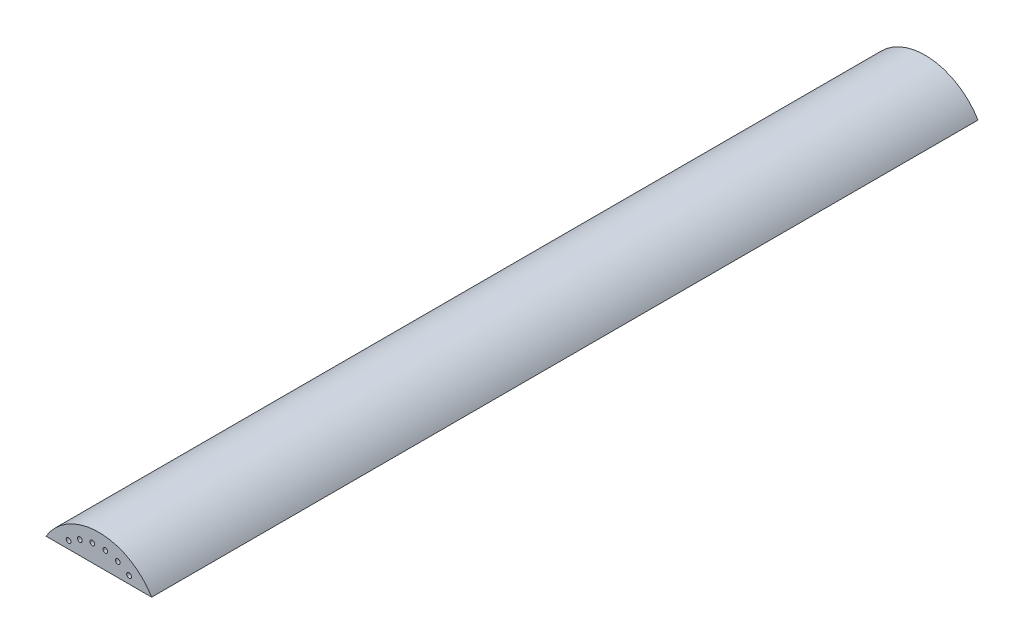
ISO-10303-21;
HEADER;
FILE_DESCRIPTION(('STEP AP214'),'2;1');
FILE_NAME('part.step','',(''),(''),'','','');
FILE_SCHEMA(('AUTOMOTIVE_DESIGN { 1 0 10303 214 1 1 1 1 }'));
ENDSEC;
DATA;
#1=APPLICATION_CONTEXT('core data for automotive mechanical design processes');
#2=APPLICATION_PROTOCOL_DEFINITION('international standard','automotive_design',2000,#1);
#3=PRODUCT_CONTEXT('',#1,'mechanical');
#4=PRODUCT('Part','Part','',(#3));
#5=PRODUCT_RELATED_PRODUCT_CATEGORY('part','',(#4));
#6=PRODUCT_DEFINITION_FORMATION('','',#4);
#7=PRODUCT_DEFINITION_CONTEXT('part definition',#1,'design');
#8=PRODUCT_DEFINITION('design','',#6,#7);
#9=PRODUCT_DEFINITION_SHAPE('','',#8);
#10=(LENGTH_UNIT() NAMED_UNIT(*) SI_UNIT(.MILLI.,.METRE.));
#11=(NAMED_UNIT(*) PLANE_ANGLE_UNIT() SI_UNIT($,.RADIAN.));
#12=(NAMED_UNIT(*) SI_UNIT($,.STERADIAN.) SOLID_ANGLE_UNIT());
#13=UNCERTAINTY_MEASURE_WITH_UNIT(LENGTH_MEASURE(1.E-05),#10,'distance_accuracy_value','');
#14=(GEOMETRIC_REPRESENTATION_CONTEXT(3) GLOBAL_UNCERTAINTY_ASSIGNED_CONTEXT((#13)) GLOBAL_UNIT_ASSIGNED_CONTEXT((#10,
#11,#12)) REPRESENTATION_CONTEXT('',''));
#15=CARTESIAN_POINT('',(0.,0.,0.));
#16=DIRECTION('',(0.,0.,1.));
#17=DIRECTION('',(1.,0.,0.));
#18=AXIS2_PLACEMENT_3D('',#15,#16,#17);
#19=CARTESIAN_POINT('',(0.,-11.8875,308.00000001));
#20=DIRECTION('',(0.,0.,-1.));
#21=DIRECTION('',(-1.,0.,0.));
#22=AXIS2_PLACEMENT_3D('',#19,#20,#21);
#23=CYLINDRICAL_SURFACE('',#22,23.);
#24=CARTESIAN_POINT('',(0.,-11.8875,0.));
#25=DIRECTION('',(0.,0.,1.));
#26=DIRECTION('',(-1.,0.,0.));
#27=AXIS2_PLACEMENT_3D('',#24,#25,#26);
#28=CIRCLE('',#27,23.);
#29=CARTESIAN_POINT('',(19.6897776460274,0.,0.));
#30=VERTEX_POINT('',#29);
#31=CARTESIAN_POINT('',(-19.6897776460274,0.,0.));
#32=VERTEX_POINT('',#31);
#33=EDGE_CURVE('E66',#30,#32,#28,.T.);
#34=ORIENTED_EDGE('',*,*,#33,.T.);
#35=DIRECTION('',(0.,0.,-1.));
#36=VECTOR('',#35,1.);
#37=CARTESIAN_POINT('',(-19.6897776460274,0.,308.00000001));
#38=LINE('',#37,#36);
#39=CARTESIAN_POINT('',(-19.6897776460274,0.,308.00000001));
#40=VERTEX_POINT('',#39);
#41=EDGE_CURVE('E11',#40,#32,#38,.T.);
#42=ORIENTED_EDGE('',*,*,#41,.F.);
#43=CARTESIAN_POINT('',(0.,-11.8875,308.00000001));
#44=DIRECTION('',(0.,0.,1.));
#45=DIRECTION('',(-1.,0.,0.));
#46=AXIS2_PLACEMENT_3D('',#43,#44,#45);
#47=CIRCLE('',#46,23.);
#48=CARTESIAN_POINT('',(19.6897776460274,0.,308.00000001));
#49=VERTEX_POINT('',#48);
#50=EDGE_CURVE('E65',#49,#40,#47,.T.);
#51=ORIENTED_EDGE('',*,*,#50,.F.);
#52=DIRECTION('',(0.,0.,-1.));
#53=VECTOR('',#52,1.);
#54=CARTESIAN_POINT('',(19.6897776460274,0.,308.00000001));
#55=LINE('',#54,#53);
#56=EDGE_CURVE('E43',#49,#30,#55,.T.);
#57=ORIENTED_EDGE('',*,*,#56,.T.);
#58=EDGE_LOOP('',(#34,#42,#51,#57));
#59=FACE_BOUND('',#58,.T.);
#60=ADVANCED_FACE('F35',(#59),#23,.T.);
#61=CARTESIAN_POINT('',(-19.6897776460274,0.,308.00000001));
#62=DIRECTION('',(0.,1.,0.));
#63=DIRECTION('',(0.,0.,1.));
#64=AXIS2_PLACEMENT_3D('',#61,#62,#63);
#65=PLANE('',#64);
#66=DIRECTION('',(1.,0.,0.));
#67=VECTOR('',#66,1.);
#68=CARTESIAN_POINT('',(-19.6897776460274,0.,0.));
#69=LINE('',#68,#67);
#70=EDGE_CURVE('E58',#32,#30,#69,.T.);
#71=ORIENTED_EDGE('',*,*,#70,.T.);
#72=ORIENTED_EDGE('',*,*,#56,.F.);
#73=DIRECTION('',(1.,0.,0.));
#74=VECTOR('',#73,1.);
#75=CARTESIAN_POINT('',(-19.6897776460274,0.,308.00000001));
#76=LINE('',#75,#74);
#77=EDGE_CURVE('E50',#40,#49,#76,.T.);
#78=ORIENTED_EDGE('',*,*,#77,.F.);
#79=ORIENTED_EDGE('',*,*,#41,.T.);
#80=EDGE_LOOP('',(#71,#72,#78,#79));
#81=FACE_BOUND('',#80,.T.);
#82=ADVANCED_FACE('F61',(#81),#65,.F.);
#83=CARTESIAN_POINT('',(0.,-11.8875,308.00000001));
#84=DIRECTION('',(0.,0.,-1.));
#85=DIRECTION('',(-1.,0.,0.));
#86=AXIS2_PLACEMENT_3D('',#83,#84,#85);
#87=PLANE('',#86);
#88=CARTESIAN_POINT('',(11.2696959545239,2.799461,308.00000001));
#89=DIRECTION('',(0.,0.,1.));
#90=DIRECTION('',(1.,0.,0.));
#91=AXIS2_PLACEMENT_3D('',#88,#89,#90);
#92=CIRCLE('',#91,0.889000000000002);
#93=CARTESIAN_POINT('',(12.1586959545239,2.799461,308.00000001));
#94=VERTEX_POINT('',#93);
#95=EDGE_CURVE('E102',#94,#94,#92,.T.);
#96=ORIENTED_EDGE('',*,*,#95,.F.);
#97=EDGE_LOOP('',(#96));
#98=FACE_BOUND('',#97,.T.);
#99=CARTESIAN_POINT('',(7.08442704165876,5.2158138,308.00000001));
#100=DIRECTION('',(0.,0.,1.));
#101=DIRECTION('',(1.,0.,0.));
#102=AXIS2_PLACEMENT_3D('',#99,#100,#101);
#103=CIRCLE('',#102,0.889000000000002);
#104=CARTESIAN_POINT('',(7.97342704165876,5.2158138,308.00000001));
#105=VERTEX_POINT('',#104);
#106=EDGE_CURVE('E96',#105,#105,#103,.T.);
#107=ORIENTED_EDGE('',*,*,#106,.F.);
#108=EDGE_LOOP('',(#107));
#109=FACE_BOUND('',#108,.T.);
#110=CARTESIAN_POINT('',(2.41636613347372,6.4666114,308.00000001));
#111=DIRECTION('',(0.,0.,1.));
#112=DIRECTION('',(1.,0.,0.));
#113=AXIS2_PLACEMENT_3D('',#110,#111,#112);
#114=CIRCLE('',#113,0.889);
#115=CARTESIAN_POINT('',(3.30536613347372,6.4666114,308.00000001));
#116=VERTEX_POINT('',#115);
#117=EDGE_CURVE('E90',#116,#116,#114,.T.);
#118=ORIENTED_EDGE('',*,*,#117,.F.);
#119=EDGE_LOOP('',(#118));
#120=FACE_BOUND('',#119,.T.);
#121=CARTESIAN_POINT('',(-2.41636613347372,6.4666114,308.00000001));
#122=DIRECTION('',(0.,0.,1.));
#123=DIRECTION('',(1.,0.,0.));
#124=AXIS2_PLACEMENT_3D('',#121,#122,#123);
#125=CIRCLE('',#124,0.889);
#126=CARTESIAN_POINT('',(-1.52736613347372,6.4666114,308.00000001));
#127=VERTEX_POINT('',#126);
#128=EDGE_CURVE('E84',#127,#127,#125,.T.);
#129=ORIENTED_EDGE('',*,*,#128,.F.);
#130=EDGE_LOOP('',(#129));
#131=FACE_BOUND('',#130,.T.);
#132=CARTESIAN_POINT('',(-7.08442704165876,5.2158138,308.00000001));
#133=DIRECTION('',(0.,0.,1.));
#134=DIRECTION('',(1.,0.,0.));
#135=AXIS2_PLACEMENT_3D('',#132,#133,#134);
#136=CIRCLE('',#135,0.889);
#137=CARTESIAN_POINT('',(-6.19542704165876,5.2158138,308.00000001));
#138=VERTEX_POINT('',#137);
#139=EDGE_CURVE('E79',#138,#138,#136,.T.);
#140=ORIENTED_EDGE('',*,*,#139,.F.);
#141=EDGE_LOOP('',(#140));
#142=FACE_BOUND('',#141,.T.);
#143=CARTESIAN_POINT('',(-11.269696041526,2.799461,308.00000001));
#144=DIRECTION('',(0.,0.,1.));
#145=DIRECTION('',(1.,0.,0.));
#146=AXIS2_PLACEMENT_3D('',#143,#144,#145);
#147=CIRCLE('',#146,0.889000000000002);
#148=CARTESIAN_POINT('',(-10.380696041526,2.799461,308.00000001));
#149=VERTEX_POINT('',#148);
#150=EDGE_CURVE('E70',#149,#149,#147,.T.);
#151=ORIENTED_EDGE('',*,*,#150,.F.);
#152=EDGE_LOOP('',(#151));
#153=FACE_BOUND('',#152,.T.);
#154=ORIENTED_EDGE('',*,*,#50,.T.);
#155=ORIENTED_EDGE('',*,*,#77,.T.);
#156=EDGE_LOOP('',(#154,#155));
#157=FACE_BOUND('',#156,.T.);
#158=ADVANCED_FACE('F113',(#98,#109,#120,#131,#142,#153,#157),#87,.F.);
#159=CARTESIAN_POINT('',(0.,-11.8875,0.));
#160=DIRECTION('',(0.,0.,-1.));
#161=DIRECTION('',(-1.,0.,0.));
#162=AXIS2_PLACEMENT_3D('',#159,#160,#161);
#163=PLANE('',#162);
#164=CARTESIAN_POINT('',(11.2696959545239,2.799461,0.));
#165=DIRECTION('',(0.,0.,-1.));
#166=DIRECTION('',(-1.,0.,0.));
#167=AXIS2_PLACEMENT_3D('',#164,#165,#166);
#168=CIRCLE('',#167,0.889000000000002);
#169=CARTESIAN_POINT('',(12.1586959545239,2.799461,0.));
#170=VERTEX_POINT('',#169);
#171=EDGE_CURVE('E105',#170,#170,#168,.F.);
#172=ORIENTED_EDGE('',*,*,#171,.T.);
#173=EDGE_LOOP('',(#172));
#174=FACE_BOUND('',#173,.T.);
#175=CARTESIAN_POINT('',(7.08442704165876,5.2158138,0.));
#176=DIRECTION('',(0.,0.,-1.));
#177=DIRECTION('',(-1.,0.,0.));
#178=AXIS2_PLACEMENT_3D('',#175,#176,#177);
#179=CIRCLE('',#178,0.889000000000002);
#180=CARTESIAN_POINT('',(7.97342704165876,5.2158138,0.));
#181=VERTEX_POINT('',#180);
#182=EDGE_CURVE('E99',#181,#181,#179,.F.);
#183=ORIENTED_EDGE('',*,*,#182,.T.);
#184=EDGE_LOOP('',(#183));
#185=FACE_BOUND('',#184,.T.);
#186=CARTESIAN_POINT('',(2.41636613347372,6.4666114,0.));
#187=DIRECTION('',(0.,0.,-1.));
#188=DIRECTION('',(-1.,0.,0.));
#189=AXIS2_PLACEMENT_3D('',#186,#187,#188);
#190=CIRCLE('',#189,0.889);
#191=CARTESIAN_POINT('',(3.30536613347372,6.4666114,0.));
#192=VERTEX_POINT('',#191);
#193=EDGE_CURVE('E93',#192,#192,#190,.F.);
#194=ORIENTED_EDGE('',*,*,#193,.T.);
#195=EDGE_LOOP('',(#194));
#196=FACE_BOUND('',#195,.T.);
#197=CARTESIAN_POINT('',(-2.41636613347372,6.4666114,0.));
#198=DIRECTION('',(0.,0.,-1.));
#199=DIRECTION('',(-1.,0.,0.));
#200=AXIS2_PLACEMENT_3D('',#197,#198,#199);
#201=CIRCLE('',#200,0.889);
#202=CARTESIAN_POINT('',(-1.52736613347372,6.4666114,0.));
#203=VERTEX_POINT('',#202);
#204=EDGE_CURVE('E87',#203,#203,#201,.F.);
#205=ORIENTED_EDGE('',*,*,#204,.T.);
#206=EDGE_LOOP('',(#205));
#207=FACE_BOUND('',#206,.T.);
#208=CARTESIAN_POINT('',(-7.08442704165876,5.2158138,0.));
#209=DIRECTION('',(0.,0.,-1.));
#210=DIRECTION('',(-1.,0.,0.));
#211=AXIS2_PLACEMENT_3D('',#208,#209,#210);
#212=CIRCLE('',#211,0.889);
#213=CARTESIAN_POINT('',(-6.19542704165876,5.2158138,0.));
#214=VERTEX_POINT('',#213);
#215=EDGE_CURVE('E81',#214,#214,#212,.F.);
#216=ORIENTED_EDGE('',*,*,#215,.T.);
#217=EDGE_LOOP('',(#216));
#218=FACE_BOUND('',#217,.T.);
#219=CARTESIAN_POINT('',(-11.269696041526,2.799461,0.));
#220=DIRECTION('',(0.,0.,-1.));
#221=DIRECTION('',(-1.,0.,0.));
#222=AXIS2_PLACEMENT_3D('',#219,#220,#221);
#223=CIRCLE('',#222,0.889000000000002);
#224=CARTESIAN_POINT('',(-10.380696041526,2.799461,0.));
#225=VERTEX_POINT('',#224);
#226=EDGE_CURVE('E73',#225,#225,#223,.F.);
#227=ORIENTED_EDGE('',*,*,#226,.T.);
#228=EDGE_LOOP('',(#227));
#229=FACE_BOUND('',#228,.T.);
#230=ORIENTED_EDGE('',*,*,#33,.F.);
#231=ORIENTED_EDGE('',*,*,#70,.F.);
#232=EDGE_LOOP('',(#230,#231));
#233=FACE_BOUND('',#232,.T.);
#234=ADVANCED_FACE('F69',(#174,#185,#196,#207,#218,#229,#233),#163,.T.);
#235=CARTESIAN_POINT('',(-11.269696041526,2.799461,-0.000999999999973245));
#236=DIRECTION('',(0.,0.,1.));
#237=DIRECTION('',(1.,0.,0.));
#238=AXIS2_PLACEMENT_3D('',#235,#236,#237);
#239=CYLINDRICAL_SURFACE('',#238,0.889000000000002);
#240=CARTESIAN_POINT('',(-10.380696041526,2.799461,0.));
#241=CARTESIAN_POINT('',(-10.380696041526,2.799461,3.20833333343749));
#242=CARTESIAN_POINT('',(-10.380696041526,2.799461,6.416666666875));
#243=CARTESIAN_POINT('',(-10.380696041526,2.799461,12.83333333375));
#244=CARTESIAN_POINT('',(-10.380696041526,2.799461,16.0416666671875));
#245=CARTESIAN_POINT('',(-10.380696041526,2.799461,22.4583333340625));
#246=CARTESIAN_POINT('',(-10.380696041526,2.799461,25.6666666675));
#247=CARTESIAN_POINT('',(-10.380696041526,2.799461,32.083333334375));
#248=CARTESIAN_POINT('',(-10.380696041526,2.799461,35.2916666678125));
#249=CARTESIAN_POINT('',(-10.380696041526,2.799461,41.7083333346875));
#250=CARTESIAN_POINT('',(-10.380696041526,2.799461,44.916666668125));
#251=CARTESIAN_POINT('',(-10.380696041526,2.799461,51.333333335));
#252=CARTESIAN_POINT('',(-10.380696041526,2.799461,54.5416666684375));
#253=CARTESIAN_POINT('',(-10.380696041526,2.799461,60.9583333353125));
#254=CARTESIAN_POINT('',(-10.380696041526,2.799461,64.16666666875));
#255=CARTESIAN_POINT('',(-10.380696041526,2.799461,70.583333335625));
#256=CARTESIAN_POINT('',(-10.380696041526,2.799461,73.7916666690625));
#257=CARTESIAN_POINT('',(-10.380696041526,2.799461,80.2083333359375));
#258=CARTESIAN_POINT('',(-10.380696041526,2.799461,83.416666669375));
#259=CARTESIAN_POINT('',(-10.380696041526,2.799461,89.83333333625));
#260=CARTESIAN_POINT('',(-10.380696041526,2.799461,93.0416666696875));
#261=CARTESIAN_POINT('',(-10.380696041526,2.799461,99.4583333365625));
#262=CARTESIAN_POINT('',(-10.380696041526,2.799461,102.66666667));
#263=CARTESIAN_POINT('',(-10.380696041526,2.799461,109.083333336875));
#264=CARTESIAN_POINT('',(-10.380696041526,2.799461,112.291666670312));
#265=CARTESIAN_POINT('',(-10.380696041526,2.799461,118.708333337187));
#266=CARTESIAN_POINT('',(-10.380696041526,2.799461,121.916666670625));
#267=CARTESIAN_POINT('',(-10.380696041526,2.799461,128.3333333375));
#268=CARTESIAN_POINT('',(-10.380696041526,2.799461,131.541666670937));
#269=CARTESIAN_POINT('',(-10.380696041526,2.799461,137.958333337812));
#270=CARTESIAN_POINT('',(-10.380696041526,2.799461,141.16666667125));
#271=CARTESIAN_POINT('',(-10.380696041526,2.799461,147.583333338125));
#272=CARTESIAN_POINT('',(-10.380696041526,2.799461,150.791666671562));
#273=CARTESIAN_POINT('',(-10.380696041526,2.799461,157.208333338437));
#274=CARTESIAN_POINT('',(-10.380696041526,2.799461,160.416666671875));
#275=CARTESIAN_POINT('',(-10.380696041526,2.799461,166.83333333875));
#276=CARTESIAN_POINT('',(-10.380696041526,2.799461,170.041666672187));
#277=CARTESIAN_POINT('',(-10.380696041526,2.799461,176.458333339062));
#278=CARTESIAN_POINT('',(-10.380696041526,2.799461,179.6666666725));
#279=CARTESIAN_POINT('',(-10.380696041526,2.799461,186.083333339375));
#280=CARTESIAN_POINT('',(-10.380696041526,2.799461,189.291666672812));
#281=CARTESIAN_POINT('',(-10.380696041526,2.799461,195.708333339687));
#282=CARTESIAN_POINT('',(-10.380696041526,2.799461,198.916666673125));
#283=CARTESIAN_POINT('',(-10.380696041526,2.799461,205.33333334));
#284=CARTESIAN_POINT('',(-10.380696041526,2.799461,208.541666673437));
#285=CARTESIAN_POINT('',(-10.380696041526,2.799461,214.958333340312));
#286=CARTESIAN_POINT('',(-10.380696041526,2.799461,218.16666667375));
#287=CARTESIAN_POINT('',(-10.380696041526,2.799461,224.583333340625));
#288=CARTESIAN_POINT('',(-10.380696041526,2.799461,227.791666674062));
#289=CARTESIAN_POINT('',(-10.380696041526,2.799461,234.208333340937));
#290=CARTESIAN_POINT('',(-10.380696041526,2.799461,237.416666674375));
#291=CARTESIAN_POINT('',(-10.380696041526,2.799461,243.83333334125));
#292=CARTESIAN_POINT('',(-10.380696041526,2.799461,247.041666674687));
#293=CARTESIAN_POINT('',(-10.380696041526,2.799461,253.458333341562));
#294=CARTESIAN_POINT('',(-10.380696041526,2.799461,256.666666675));
#295=CARTESIAN_POINT('',(-10.380696041526,2.799461,263.083333341875));
#296=CARTESIAN_POINT('',(-10.380696041526,2.799461,266.291666675312));
#297=CARTESIAN_POINT('',(-10.380696041526,2.799461,272.708333342187));
#298=CARTESIAN_POINT('',(-10.380696041526,2.799461,275.916666675625));
#299=CARTESIAN_POINT('',(-10.380696041526,2.799461,282.3333333425));
#300=CARTESIAN_POINT('',(-10.380696041526,2.799461,285.541666675937));
#301=CARTESIAN_POINT('',(-10.380696041526,2.799461,291.958333342812));
#302=CARTESIAN_POINT('',(-10.380696041526,2.799461,295.16666667625));
#303=CARTESIAN_POINT('',(-10.380696041526,2.799461,301.583333343125));
#304=CARTESIAN_POINT('',(-10.380696041526,2.799461,304.791666676562));
#305=CARTESIAN_POINT('',(-10.380696041526,2.799461,308.00000001));
#306=B_SPLINE_CURVE_WITH_KNOTS('',3,(#240,#241,#242,#243,#244,#245,#246,#247,#248,#249,#250,
#251,#252,#253,#254,#255,#256,#257,#258,#259,#260,#261,#262,#263,#264,#265,#266,#267,#268,#269,
#270,#271,#272,#273,#274,#275,#276,#277,#278,#279,#280,#281,#282,#283,#284,#285,#286,#287,#288,
#289,#290,#291,#292,#293,#294,#295,#296,#297,#298,#299,#300,#301,#302,#303,#304,#305),
.UNSPECIFIED.,.F.,.F.,(4,2,2,2,2,2,2,2,2,2,2,2,2,2,2,2,2,2,2,2,2,2,2,2,2,2,2,2,2,2,2,2,4),(0.,
9.6250000003125,19.250000000625,28.8750000009375,38.50000000125,48.1250000015625,
57.750000001875,67.3750000021875,77.0000000025,86.6250000028125,96.250000003125,
105.875000003437,115.50000000375,125.125000004062,134.750000004375,144.375000004687,
154.000000005,163.625000005312,173.250000005625,182.875000005937,192.50000000625,
202.125000006562,211.750000006875,221.375000007187,231.0000000075,240.625000007812,
250.250000008125,259.875000008437,269.50000000875,279.125000009062,288.750000009375,
298.375000009687,308.00000001),.UNSPECIFIED.);
#307=EDGE_CURVE('BSEAM127',#225,#149,#306,.T.);
#308=ORIENTED_EDGE('',*,*,#226,.F.);
#309=ORIENTED_EDGE('',*,*,#150,.T.);
#310=ORIENTED_EDGE('',*,*,#307,.T.);
#311=ORIENTED_EDGE('',*,*,#307,.F.);
#312=EDGE_LOOP('',(#308,#310,#309,#311));
#313=FACE_BOUND('',#312,.T.);
#314=ADVANCED_FACE('F127',(#313),#239,.F.);
#315=CARTESIAN_POINT('',(-7.08442704165876,5.2158138,-0.000999999999973245));
#316=DIRECTION('',(0.,0.,1.));
#317=DIRECTION('',(1.,0.,0.));
#318=AXIS2_PLACEMENT_3D('',#315,#316,#317);
#319=CYLINDRICAL_SURFACE('',#318,0.889);
#320=CARTESIAN_POINT('',(-6.19542704165876,5.2158138,0.));
#321=CARTESIAN_POINT('',(-6.19542704165876,5.2158138,3.20833333343749));
#322=CARTESIAN_POINT('',(-6.19542704165876,5.2158138,6.416666666875));
#323=CARTESIAN_POINT('',(-6.19542704165876,5.2158138,12.83333333375));
#324=CARTESIAN_POINT('',(-6.19542704165876,5.2158138,16.0416666671875));
#325=CARTESIAN_POINT('',(-6.19542704165876,5.2158138,22.4583333340625));
#326=CARTESIAN_POINT('',(-6.19542704165876,5.2158138,25.6666666675));
#327=CARTESIAN_POINT('',(-6.19542704165876,5.2158138,32.083333334375));
#328=CARTESIAN_POINT('',(-6.19542704165876,5.2158138,35.2916666678125));
#329=CARTESIAN_POINT('',(-6.19542704165876,5.2158138,41.7083333346875));
#330=CARTESIAN_POINT('',(-6.19542704165876,5.2158138,44.916666668125));
#331=CARTESIAN_POINT('',(-6.19542704165876,5.2158138,51.333333335));
#332=CARTESIAN_POINT('',(-6.19542704165876,5.2158138,54.5416666684375));
#333=CARTESIAN_POINT('',(-6.19542704165876,5.2158138,60.9583333353125));
#334=CARTESIAN_POINT('',(-6.19542704165876,5.2158138,64.16666666875));
#335=CARTESIAN_POINT('',(-6.19542704165876,5.2158138,70.583333335625));
#336=CARTESIAN_POINT('',(-6.19542704165876,5.2158138,73.7916666690625));
#337=CARTESIAN_POINT('',(-6.19542704165876,5.2158138,80.2083333359375));
#338=CARTESIAN_POINT('',(-6.19542704165876,5.2158138,83.416666669375));
#339=CARTESIAN_POINT('',(-6.19542704165876,5.2158138,89.83333333625));
#340=CARTESIAN_POINT('',(-6.19542704165876,5.2158138,93.0416666696875));
#341=CARTESIAN_POINT('',(-6.19542704165876,5.2158138,99.4583333365625));
#342=CARTESIAN_POINT('',(-6.19542704165876,5.2158138,102.66666667));
#343=CARTESIAN_POINT('',(-6.19542704165876,5.2158138,109.083333336875));
#344=CARTESIAN_POINT('',(-6.19542704165876,5.2158138,112.291666670312));
#345=CARTESIAN_POINT('',(-6.19542704165876,5.2158138,118.708333337187));
#346=CARTESIAN_POINT('',(-6.19542704165876,5.2158138,121.916666670625));
#347=CARTESIAN_POINT('',(-6.19542704165876,5.2158138,128.3333333375));
#348=CARTESIAN_POINT('',(-6.19542704165876,5.2158138,131.541666670937));
#349=CARTESIAN_POINT('',(-6.19542704165876,5.2158138,137.958333337812));
#350=CARTESIAN_POINT('',(-6.19542704165876,5.2158138,141.16666667125));
#351=CARTESIAN_POINT('',(-6.19542704165876,5.2158138,147.583333338125));
#352=CARTESIAN_POINT('',(-6.19542704165876,5.2158138,150.791666671562));
#353=CARTESIAN_POINT('',(-6.19542704165876,5.2158138,157.208333338437));
#354=CARTESIAN_POINT('',(-6.19542704165876,5.2158138,160.416666671875));
#355=CARTESIAN_POINT('',(-6.19542704165876,5.2158138,166.83333333875));
#356=CARTESIAN_POINT('',(-6.19542704165876,5.2158138,170.041666672187));
#357=CARTESIAN_POINT('',(-6.19542704165876,5.2158138,176.458333339062));
#358=CARTESIAN_POINT('',(-6.19542704165876,5.2158138,179.6666666725));
#359=CARTESIAN_POINT('',(-6.19542704165876,5.2158138,186.083333339375));
#360=CARTESIAN_POINT('',(-6.19542704165876,5.2158138,189.291666672812));
#361=CARTESIAN_POINT('',(-6.19542704165876,5.2158138,195.708333339687));
#362=CARTESIAN_POINT('',(-6.19542704165876,5.2158138,198.916666673125));
#363=CARTESIAN_POINT('',(-6.19542704165876,5.2158138,205.33333334));
#364=CARTESIAN_POINT('',(-6.19542704165876,5.2158138,208.541666673437));
#365=CARTESIAN_POINT('',(-6.19542704165876,5.2158138,214.958333340312));
#366=CARTESIAN_POINT('',(-6.19542704165876,5.2158138,218.16666667375));
#367=CARTESIAN_POINT('',(-6.19542704165876,5.2158138,224.583333340625));
#368=CARTESIAN_POINT('',(-6.19542704165876,5.2158138,227.791666674062));
#369=CARTESIAN_POINT('',(-6.19542704165876,5.2158138,234.208333340937));
#370=CARTESIAN_POINT('',(-6.19542704165876,5.2158138,237.416666674375));
#371=CARTESIAN_POINT('',(-6.19542704165876,5.2158138,243.83333334125));
#372=CARTESIAN_POINT('',(-6.19542704165876,5.2158138,247.041666674687));
#373=CARTESIAN_POINT('',(-6.19542704165876,5.2158138,253.458333341562));
#374=CARTESIAN_POINT('',(-6.19542704165876,5.2158138,256.666666675));
#375=CARTESIAN_POINT('',(-6.19542704165876,5.2158138,263.083333341875));
#376=CARTESIAN_POINT('',(-6.19542704165876,5.2158138,266.291666675312));
#377=CARTESIAN_POINT('',(-6.19542704165876,5.2158138,272.708333342187));
#378=CARTESIAN_POINT('',(-6.19542704165876,5.2158138,275.916666675625));
#379=CARTESIAN_POINT('',(-6.19542704165876,5.2158138,282.3333333425));
#380=CARTESIAN_POINT('',(-6.19542704165876,5.2158138,285.541666675937));
#381=CARTESIAN_POINT('',(-6.19542704165876,5.2158138,291.958333342812));
#382=CARTESIAN_POINT('',(-6.19542704165876,5.2158138,295.16666667625));
#383=CARTESIAN_POINT('',(-6.19542704165876,5.2158138,301.583333343125));
#384=CARTESIAN_POINT('',(-6.19542704165876,5.2158138,304.791666676562));
#385=CARTESIAN_POINT('',(-6.19542704165876,5.2158138,308.00000001));
#386=B_SPLINE_CURVE_WITH_KNOTS('',3,(#320,#321,#322,#323,#324,#325,#326,#327,#328,#329,#330,
#331,#332,#333,#334,#335,#336,#337,#338,#339,#340,#341,#342,#343,#344,#345,#346,#347,#348,#349,
#350,#351,#352,#353,#354,#355,#356,#357,#358,#359,#360,#361,#362,#363,#364,#365,#366,#367,#368,
#369,#370,#371,#372,#373,#374,#375,#376,#377,#378,#379,#380,#381,#382,#383,#384,#385),
.UNSPECIFIED.,.F.,.F.,(4,2,2,2,2,2,2,2,2,2,2,2,2,2,2,2,2,2,2,2,2,2,2,2,2,2,2,2,2,2,2,2,4),(0.,
9.6250000003125,19.250000000625,28.8750000009375,38.50000000125,48.1250000015625,
57.750000001875,67.3750000021875,77.0000000025,86.6250000028125,96.250000003125,
105.875000003437,115.50000000375,125.125000004062,134.750000004375,144.375000004687,
154.000000005,163.625000005312,173.250000005625,182.875000005937,192.50000000625,
202.125000006562,211.750000006875,221.375000007187,231.0000000075,240.625000007812,
250.250000008125,259.875000008437,269.50000000875,279.125000009062,288.750000009375,
298.375000009687,308.00000001),.UNSPECIFIED.);
#387=EDGE_CURVE('BSEAM129',#214,#138,#386,.T.);
#388=ORIENTED_EDGE('',*,*,#215,.F.);
#389=ORIENTED_EDGE('',*,*,#139,.T.);
#390=ORIENTED_EDGE('',*,*,#387,.T.);
#391=ORIENTED_EDGE('',*,*,#387,.F.);
#392=EDGE_LOOP('',(#388,#390,#389,#391));
#393=FACE_BOUND('',#392,.T.);
#394=ADVANCED_FACE('F129',(#393),#319,.F.);
#395=CARTESIAN_POINT('',(-2.41636613347372,6.4666114,-0.000999999999973245));
#396=DIRECTION('',(0.,0.,1.));
#397=DIRECTION('',(1.,0.,0.));
#398=AXIS2_PLACEMENT_3D('',#395,#396,#397);
#399=CYLINDRICAL_SURFACE('',#398,0.889);
#400=CARTESIAN_POINT('',(-1.52736613347372,6.4666114,0.));
#401=CARTESIAN_POINT('',(-1.52736613347372,6.4666114,3.20833333343749));
#402=CARTESIAN_POINT('',(-1.52736613347372,6.4666114,6.416666666875));
#403=CARTESIAN_POINT('',(-1.52736613347372,6.4666114,12.83333333375));
#404=CARTESIAN_POINT('',(-1.52736613347372,6.4666114,16.0416666671875));
#405=CARTESIAN_POINT('',(-1.52736613347372,6.4666114,22.4583333340625));
#406=CARTESIAN_POINT('',(-1.52736613347372,6.4666114,25.6666666675));
#407=CARTESIAN_POINT('',(-1.52736613347372,6.4666114,32.083333334375));
#408=CARTESIAN_POINT('',(-1.52736613347372,6.4666114,35.2916666678125));
#409=CARTESIAN_POINT('',(-1.52736613347372,6.4666114,41.7083333346875));
#410=CARTESIAN_POINT('',(-1.52736613347372,6.4666114,44.916666668125));
#411=CARTESIAN_POINT('',(-1.52736613347372,6.4666114,51.333333335));
#412=CARTESIAN_POINT('',(-1.52736613347372,6.4666114,54.5416666684375));
#413=CARTESIAN_POINT('',(-1.52736613347372,6.4666114,60.9583333353125));
#414=CARTESIAN_POINT('',(-1.52736613347372,6.4666114,64.16666666875));
#415=CARTESIAN_POINT('',(-1.52736613347372,6.4666114,70.583333335625));
#416=CARTESIAN_POINT('',(-1.52736613347372,6.4666114,73.7916666690625));
#417=CARTESIAN_POINT('',(-1.52736613347372,6.4666114,80.2083333359375));
#418=CARTESIAN_POINT('',(-1.52736613347372,6.4666114,83.416666669375));
#419=CARTESIAN_POINT('',(-1.52736613347372,6.4666114,89.83333333625));
#420=CARTESIAN_POINT('',(-1.52736613347372,6.4666114,93.0416666696875));
#421=CARTESIAN_POINT('',(-1.52736613347372,6.4666114,99.4583333365625));
#422=CARTESIAN_POINT('',(-1.52736613347372,6.4666114,102.66666667));
#423=CARTESIAN_POINT('',(-1.52736613347372,6.4666114,109.083333336875));
#424=CARTESIAN_POINT('',(-1.52736613347372,6.4666114,112.291666670312));
#425=CARTESIAN_POINT('',(-1.52736613347372,6.4666114,118.708333337187));
#426=CARTESIAN_POINT('',(-1.52736613347372,6.4666114,121.916666670625));
#427=CARTESIAN_POINT('',(-1.52736613347372,6.4666114,128.3333333375));
#428=CARTESIAN_POINT('',(-1.52736613347372,6.4666114,131.541666670937));
#429=CARTESIAN_POINT('',(-1.52736613347372,6.4666114,137.958333337812));
#430=CARTESIAN_POINT('',(-1.52736613347372,6.4666114,141.16666667125));
#431=CARTESIAN_POINT('',(-1.52736613347372,6.4666114,147.583333338125));
#432=CARTESIAN_POINT('',(-1.52736613347372,6.4666114,150.791666671562));
#433=CARTESIAN_POINT('',(-1.52736613347372,6.4666114,157.208333338437));
#434=CARTESIAN_POINT('',(-1.52736613347372,6.4666114,160.416666671875));
#435=CARTESIAN_POINT('',(-1.52736613347372,6.4666114,166.83333333875));
#436=CARTESIAN_POINT('',(-1.52736613347372,6.4666114,170.041666672187));
#437=CARTESIAN_POINT('',(-1.52736613347372,6.4666114,176.458333339062));
#438=CARTESIAN_POINT('',(-1.52736613347372,6.4666114,179.6666666725));
#439=CARTESIAN_POINT('',(-1.52736613347372,6.4666114,186.083333339375));
#440=CARTESIAN_POINT('',(-1.52736613347372,6.4666114,189.291666672812));
#441=CARTESIAN_POINT('',(-1.52736613347372,6.4666114,195.708333339687));
#442=CARTESIAN_POINT('',(-1.52736613347372,6.4666114,198.916666673125));
#443=CARTESIAN_POINT('',(-1.52736613347372,6.4666114,205.33333334));
#444=CARTESIAN_POINT('',(-1.52736613347372,6.4666114,208.541666673437));
#445=CARTESIAN_POINT('',(-1.52736613347372,6.4666114,214.958333340312));
#446=CARTESIAN_POINT('',(-1.52736613347372,6.4666114,218.16666667375));
#447=CARTESIAN_POINT('',(-1.52736613347372,6.4666114,224.583333340625));
#448=CARTESIAN_POINT('',(-1.52736613347372,6.4666114,227.791666674062));
#449=CARTESIAN_POINT('',(-1.52736613347372,6.4666114,234.208333340937));
#450=CARTESIAN_POINT('',(-1.52736613347372,6.4666114,237.416666674375));
#451=CARTESIAN_POINT('',(-1.52736613347372,6.4666114,243.83333334125));
#452=CARTESIAN_POINT('',(-1.52736613347372,6.4666114,247.041666674687));
#453=CARTESIAN_POINT('',(-1.52736613347372,6.4666114,253.458333341562));
#454=CARTESIAN_POINT('',(-1.52736613347372,6.4666114,256.666666675));
#455=CARTESIAN_POINT('',(-1.52736613347372,6.4666114,263.083333341875));
#456=CARTESIAN_POINT('',(-1.52736613347372,6.4666114,266.291666675312));
#457=CARTESIAN_POINT('',(-1.52736613347372,6.4666114,272.708333342187));
#458=CARTESIAN_POINT('',(-1.52736613347372,6.4666114,275.916666675625));
#459=CARTESIAN_POINT('',(-1.52736613347372,6.4666114,282.3333333425));
#460=CARTESIAN_POINT('',(-1.52736613347372,6.4666114,285.541666675937));
#461=CARTESIAN_POINT('',(-1.52736613347372,6.4666114,291.958333342812));
#462=CARTESIAN_POINT('',(-1.52736613347372,6.4666114,295.16666667625));
#463=CARTESIAN_POINT('',(-1.52736613347372,6.4666114,301.583333343125));
#464=CARTESIAN_POINT('',(-1.52736613347372,6.4666114,304.791666676562));
#465=CARTESIAN_POINT('',(-1.52736613347372,6.4666114,308.00000001));
#466=B_SPLINE_CURVE_WITH_KNOTS('',3,(#400,#401,#402,#403,#404,#405,#406,#407,#408,#409,#410,
#411,#412,#413,#414,#415,#416,#417,#418,#419,#420,#421,#422,#423,#424,#425,#426,#427,#428,#429,
#430,#431,#432,#433,#434,#435,#436,#437,#438,#439,#440,#441,#442,#443,#444,#445,#446,#447,#448,
#449,#450,#451,#452,#453,#454,#455,#456,#457,#458,#459,#460,#461,#462,#463,#464,#465),
.UNSPECIFIED.,.F.,.F.,(4,2,2,2,2,2,2,2,2,2,2,2,2,2,2,2,2,2,2,2,2,2,2,2,2,2,2,2,2,2,2,2,4),(0.,
9.6250000003125,19.250000000625,28.8750000009375,38.50000000125,48.1250000015625,
57.750000001875,67.3750000021875,77.0000000025,86.6250000028125,96.250000003125,
105.875000003437,115.50000000375,125.125000004062,134.750000004375,144.375000004687,
154.000000005,163.625000005312,173.250000005625,182.875000005937,192.50000000625,
202.125000006562,211.750000006875,221.375000007187,231.0000000075,240.625000007812,
250.250000008125,259.875000008437,269.50000000875,279.125000009062,288.750000009375,
298.375000009687,308.00000001),.UNSPECIFIED.);
#467=EDGE_CURVE('BSEAM136',#203,#127,#466,.T.);
#468=ORIENTED_EDGE('',*,*,#204,.F.);
#469=ORIENTED_EDGE('',*,*,#128,.T.);
#470=ORIENTED_EDGE('',*,*,#467,.T.);
#471=ORIENTED_EDGE('',*,*,#467,.F.);
#472=EDGE_LOOP('',(#468,#470,#469,#471));
#473=FACE_BOUND('',#472,.T.);
#474=ADVANCED_FACE('F136',(#473),#399,.F.);
#475=CARTESIAN_POINT('',(2.41636613347372,6.4666114,-0.000999999999973245));
#476=DIRECTION('',(0.,0.,1.));
#477=DIRECTION('',(1.,0.,0.));
#478=AXIS2_PLACEMENT_3D('',#475,#476,#477);
#479=CYLINDRICAL_SURFACE('',#478,0.889);
#480=CARTESIAN_POINT('',(3.30536613347372,6.4666114,0.));
#481=CARTESIAN_POINT('',(3.30536613347372,6.4666114,3.20833333343749));
#482=CARTESIAN_POINT('',(3.30536613347372,6.4666114,6.416666666875));
#483=CARTESIAN_POINT('',(3.30536613347372,6.4666114,12.83333333375));
#484=CARTESIAN_POINT('',(3.30536613347372,6.4666114,16.0416666671875));
#485=CARTESIAN_POINT('',(3.30536613347372,6.4666114,22.4583333340625));
#486=CARTESIAN_POINT('',(3.30536613347372,6.4666114,25.6666666675));
#487=CARTESIAN_POINT('',(3.30536613347372,6.4666114,32.083333334375));
#488=CARTESIAN_POINT('',(3.30536613347372,6.4666114,35.2916666678125));
#489=CARTESIAN_POINT('',(3.30536613347372,6.4666114,41.7083333346875));
#490=CARTESIAN_POINT('',(3.30536613347372,6.4666114,44.916666668125));
#491=CARTESIAN_POINT('',(3.30536613347372,6.4666114,51.333333335));
#492=CARTESIAN_POINT('',(3.30536613347372,6.4666114,54.5416666684375));
#493=CARTESIAN_POINT('',(3.30536613347372,6.4666114,60.9583333353125));
#494=CARTESIAN_POINT('',(3.30536613347372,6.4666114,64.16666666875));
#495=CARTESIAN_POINT('',(3.30536613347372,6.4666114,70.583333335625));
#496=CARTESIAN_POINT('',(3.30536613347372,6.4666114,73.7916666690625));
#497=CARTESIAN_POINT('',(3.30536613347372,6.4666114,80.2083333359375));
#498=CARTESIAN_POINT('',(3.30536613347372,6.4666114,83.416666669375));
#499=CARTESIAN_POINT('',(3.30536613347372,6.4666114,89.83333333625));
#500=CARTESIAN_POINT('',(3.30536613347372,6.4666114,93.0416666696875));
#501=CARTESIAN_POINT('',(3.30536613347372,6.4666114,99.4583333365625));
#502=CARTESIAN_POINT('',(3.30536613347372,6.4666114,102.66666667));
#503=CARTESIAN_POINT('',(3.30536613347372,6.4666114,109.083333336875));
#504=CARTESIAN_POINT('',(3.30536613347372,6.4666114,112.291666670312));
#505=CARTESIAN_POINT('',(3.30536613347372,6.4666114,118.708333337187));
#506=CARTESIAN_POINT('',(3.30536613347372,6.4666114,121.916666670625));
#507=CARTESIAN_POINT('',(3.30536613347372,6.4666114,128.3333333375));
#508=CARTESIAN_POINT('',(3.30536613347372,6.4666114,131.541666670937));
#509=CARTESIAN_POINT('',(3.30536613347372,6.4666114,137.958333337812));
#510=CARTESIAN_POINT('',(3.30536613347372,6.4666114,141.16666667125));
#511=CARTESIAN_POINT('',(3.30536613347372,6.4666114,147.583333338125));
#512=CARTESIAN_POINT('',(3.30536613347372,6.4666114,150.791666671562));
#513=CARTESIAN_POINT('',(3.30536613347372,6.4666114,157.208333338437));
#514=CARTESIAN_POINT('',(3.30536613347372,6.4666114,160.416666671875));
#515=CARTESIAN_POINT('',(3.30536613347372,6.4666114,166.83333333875));
#516=CARTESIAN_POINT('',(3.30536613347372,6.4666114,170.041666672187));
#517=CARTESIAN_POINT('',(3.30536613347372,6.4666114,176.458333339062));
#518=CARTESIAN_POINT('',(3.30536613347372,6.4666114,179.6666666725));
#519=CARTESIAN_POINT('',(3.30536613347372,6.4666114,186.083333339375));
#520=CARTESIAN_POINT('',(3.30536613347372,6.4666114,189.291666672812));
#521=CARTESIAN_POINT('',(3.30536613347372,6.4666114,195.708333339687));
#522=CARTESIAN_POINT('',(3.30536613347372,6.4666114,198.916666673125));
#523=CARTESIAN_POINT('',(3.30536613347372,6.4666114,205.33333334));
#524=CARTESIAN_POINT('',(3.30536613347372,6.4666114,208.541666673437));
#525=CARTESIAN_POINT('',(3.30536613347372,6.4666114,214.958333340312));
#526=CARTESIAN_POINT('',(3.30536613347372,6.4666114,218.16666667375));
#527=CARTESIAN_POINT('',(3.30536613347372,6.4666114,224.583333340625));
#528=CARTESIAN_POINT('',(3.30536613347372,6.4666114,227.791666674062));
#529=CARTESIAN_POINT('',(3.30536613347372,6.4666114,234.208333340937));
#530=CARTESIAN_POINT('',(3.30536613347372,6.4666114,237.416666674375));
#531=CARTESIAN_POINT('',(3.30536613347372,6.4666114,243.83333334125));
#532=CARTESIAN_POINT('',(3.30536613347372,6.4666114,247.041666674687));
#533=CARTESIAN_POINT('',(3.30536613347372,6.4666114,253.458333341562));
#534=CARTESIAN_POINT('',(3.30536613347372,6.4666114,256.666666675));
#535=CARTESIAN_POINT('',(3.30536613347372,6.4666114,263.083333341875));
#536=CARTESIAN_POINT('',(3.30536613347372,6.4666114,266.291666675312));
#537=CARTESIAN_POINT('',(3.30536613347372,6.4666114,272.708333342187));
#538=CARTESIAN_POINT('',(3.30536613347372,6.4666114,275.916666675625));
#539=CARTESIAN_POINT('',(3.30536613347372,6.4666114,282.3333333425));
#540=CARTESIAN_POINT('',(3.30536613347372,6.4666114,285.541666675937));
#541=CARTESIAN_POINT('',(3.30536613347372,6.4666114,291.958333342812));
#542=CARTESIAN_POINT('',(3.30536613347372,6.4666114,295.16666667625));
#543=CARTESIAN_POINT('',(3.30536613347372,6.4666114,301.583333343125));
#544=CARTESIAN_POINT('',(3.30536613347372,6.4666114,304.791666676562));
#545=CARTESIAN_POINT('',(3.30536613347372,6.4666114,308.00000001));
#546=B_SPLINE_CURVE_WITH_KNOTS('',3,(#480,#481,#482,#483,#484,#485,#486,#487,#488,#489,#490,
#491,#492,#493,#494,#495,#496,#497,#498,#499,#500,#501,#502,#503,#504,#505,#506,#507,#508,#509,
#510,#511,#512,#513,#514,#515,#516,#517,#518,#519,#520,#521,#522,#523,#524,#525,#526,#527,#528,
#529,#530,#531,#532,#533,#534,#535,#536,#537,#538,#539,#540,#541,#542,#543,#544,#545),
.UNSPECIFIED.,.F.,.F.,(4,2,2,2,2,2,2,2,2,2,2,2,2,2,2,2,2,2,2,2,2,2,2,2,2,2,2,2,2,2,2,2,4),(0.,
9.6250000003125,19.250000000625,28.8750000009375,38.50000000125,48.1250000015625,
57.750000001875,67.3750000021875,77.0000000025,86.6250000028125,96.250000003125,
105.875000003437,115.50000000375,125.125000004062,134.750000004375,144.375000004687,
154.000000005,163.625000005312,173.250000005625,182.875000005937,192.50000000625,
202.125000006562,211.750000006875,221.375000007187,231.0000000075,240.625000007812,
250.250000008125,259.875000008437,269.50000000875,279.125000009062,288.750000009375,
298.375000009687,308.00000001),.UNSPECIFIED.);
#547=EDGE_CURVE('BSEAM175',#192,#116,#546,.T.);
#548=ORIENTED_EDGE('',*,*,#193,.F.);
#549=ORIENTED_EDGE('',*,*,#117,.T.);
#550=ORIENTED_EDGE('',*,*,#547,.T.);
#551=ORIENTED_EDGE('',*,*,#547,.F.);
#552=EDGE_LOOP('',(#548,#550,#549,#551));
#553=FACE_BOUND('',#552,.T.);
#554=ADVANCED_FACE('F175',(#553),#479,.F.);
#555=CARTESIAN_POINT('',(7.08442704165876,5.2158138,-0.000999999999973245));
#556=DIRECTION('',(0.,0.,1.));
#557=DIRECTION('',(1.,0.,0.));
#558=AXIS2_PLACEMENT_3D('',#555,#556,#557);
#559=CYLINDRICAL_SURFACE('',#558,0.889000000000002);
#560=CARTESIAN_POINT('',(7.97342704165876,5.2158138,0.));
#561=CARTESIAN_POINT('',(7.97342704165876,5.2158138,3.20833333343749));
#562=CARTESIAN_POINT('',(7.97342704165876,5.2158138,6.416666666875));
#563=CARTESIAN_POINT('',(7.97342704165876,5.2158138,12.83333333375));
#564=CARTESIAN_POINT('',(7.97342704165876,5.2158138,16.0416666671875));
#565=CARTESIAN_POINT('',(7.97342704165876,5.2158138,22.4583333340625));
#566=CARTESIAN_POINT('',(7.97342704165876,5.2158138,25.6666666675));
#567=CARTESIAN_POINT('',(7.97342704165876,5.2158138,32.083333334375));
#568=CARTESIAN_POINT('',(7.97342704165876,5.2158138,35.2916666678125));
#569=CARTESIAN_POINT('',(7.97342704165876,5.2158138,41.7083333346875));
#570=CARTESIAN_POINT('',(7.97342704165876,5.2158138,44.916666668125));
#571=CARTESIAN_POINT('',(7.97342704165876,5.2158138,51.333333335));
#572=CARTESIAN_POINT('',(7.97342704165876,5.2158138,54.5416666684375));
#573=CARTESIAN_POINT('',(7.97342704165876,5.2158138,60.9583333353125));
#574=CARTESIAN_POINT('',(7.97342704165876,5.2158138,64.16666666875));
#575=CARTESIAN_POINT('',(7.97342704165876,5.2158138,70.583333335625));
#576=CARTESIAN_POINT('',(7.97342704165876,5.2158138,73.7916666690625));
#577=CARTESIAN_POINT('',(7.97342704165876,5.2158138,80.2083333359375));
#578=CARTESIAN_POINT('',(7.97342704165876,5.2158138,83.416666669375));
#579=CARTESIAN_POINT('',(7.97342704165876,5.2158138,89.83333333625));
#580=CARTESIAN_POINT('',(7.97342704165876,5.2158138,93.0416666696875));
#581=CARTESIAN_POINT('',(7.97342704165876,5.2158138,99.4583333365625));
#582=CARTESIAN_POINT('',(7.97342704165876,5.2158138,102.66666667));
#583=CARTESIAN_POINT('',(7.97342704165876,5.2158138,109.083333336875));
#584=CARTESIAN_POINT('',(7.97342704165876,5.2158138,112.291666670312));
#585=CARTESIAN_POINT('',(7.97342704165876,5.2158138,118.708333337187));
#586=CARTESIAN_POINT('',(7.97342704165876,5.2158138,121.916666670625));
#587=CARTESIAN_POINT('',(7.97342704165876,5.2158138,128.3333333375));
#588=CARTESIAN_POINT('',(7.97342704165876,5.2158138,131.541666670937));
#589=CARTESIAN_POINT('',(7.97342704165876,5.2158138,137.958333337812));
#590=CARTESIAN_POINT('',(7.97342704165876,5.2158138,141.16666667125));
#591=CARTESIAN_POINT('',(7.97342704165876,5.2158138,147.583333338125));
#592=CARTESIAN_POINT('',(7.97342704165876,5.2158138,150.791666671562));
#593=CARTESIAN_POINT('',(7.97342704165876,5.2158138,157.208333338437));
#594=CARTESIAN_POINT('',(7.97342704165876,5.2158138,160.416666671875));
#595=CARTESIAN_POINT('',(7.97342704165876,5.2158138,166.83333333875));
#596=CARTESIAN_POINT('',(7.97342704165876,5.2158138,170.041666672187));
#597=CARTESIAN_POINT('',(7.97342704165876,5.2158138,176.458333339062));
#598=CARTESIAN_POINT('',(7.97342704165876,5.2158138,179.6666666725));
#599=CARTESIAN_POINT('',(7.97342704165876,5.2158138,186.083333339375));
#600=CARTESIAN_POINT('',(7.97342704165876,5.2158138,189.291666672812));
#601=CARTESIAN_POINT('',(7.97342704165876,5.2158138,195.708333339687));
#602=CARTESIAN_POINT('',(7.97342704165876,5.2158138,198.916666673125));
#603=CARTESIAN_POINT('',(7.97342704165876,5.2158138,205.33333334));
#604=CARTESIAN_POINT('',(7.97342704165876,5.2158138,208.541666673437));
#605=CARTESIAN_POINT('',(7.97342704165876,5.2158138,214.958333340312));
#606=CARTESIAN_POINT('',(7.97342704165876,5.2158138,218.16666667375));
#607=CARTESIAN_POINT('',(7.97342704165876,5.2158138,224.583333340625));
#608=CARTESIAN_POINT('',(7.97342704165876,5.2158138,227.791666674062));
#609=CARTESIAN_POINT('',(7.97342704165876,5.2158138,234.208333340937));
#610=CARTESIAN_POINT('',(7.97342704165876,5.2158138,237.416666674375));
#611=CARTESIAN_POINT('',(7.97342704165876,5.2158138,243.83333334125));
#612=CARTESIAN_POINT('',(7.97342704165876,5.2158138,247.041666674687));
#613=CARTESIAN_POINT('',(7.97342704165876,5.2158138,253.458333341562));
#614=CARTESIAN_POINT('',(7.97342704165876,5.2158138,256.666666675));
#615=CARTESIAN_POINT('',(7.97342704165876,5.2158138,263.083333341875));
#616=CARTESIAN_POINT('',(7.97342704165876,5.2158138,266.291666675312));
#617=CARTESIAN_POINT('',(7.97342704165876,5.2158138,272.708333342187));
#618=CARTESIAN_POINT('',(7.97342704165876,5.2158138,275.916666675625));
#619=CARTESIAN_POINT('',(7.97342704165876,5.2158138,282.3333333425));
#620=CARTESIAN_POINT('',(7.97342704165876,5.2158138,285.541666675937));
#621=CARTESIAN_POINT('',(7.97342704165876,5.2158138,291.958333342812));
#622=CARTESIAN_POINT('',(7.97342704165876,5.2158138,295.16666667625));
#623=CARTESIAN_POINT('',(7.97342704165876,5.2158138,301.583333343125));
#624=CARTESIAN_POINT('',(7.97342704165876,5.2158138,304.791666676562));
#625=CARTESIAN_POINT('',(7.97342704165876,5.2158138,308.00000001));
#626=B_SPLINE_CURVE_WITH_KNOTS('',3,(#560,#561,#562,#563,#564,#565,#566,#567,#568,#569,#570,
#571,#572,#573,#574,#575,#576,#577,#578,#579,#580,#581,#582,#583,#584,#585,#586,#587,#588,#589,
#590,#591,#592,#593,#594,#595,#596,#597,#598,#599,#600,#601,#602,#603,#604,#605,#606,#607,#608,
#609,#610,#611,#612,#613,#614,#615,#616,#617,#618,#619,#620,#621,#622,#623,#624,#625),
.UNSPECIFIED.,.F.,.F.,(4,2,2,2,2,2,2,2,2,2,2,2,2,2,2,2,2,2,2,2,2,2,2,2,2,2,2,2,2,2,2,2,4),(0.,
9.6250000003125,19.250000000625,28.8750000009375,38.50000000125,48.1250000015625,
57.750000001875,67.3750000021875,77.0000000025,86.6250000028125,96.250000003125,
105.875000003437,115.50000000375,125.125000004062,134.750000004375,144.375000004687,
154.000000005,163.625000005312,173.250000005625,182.875000005937,192.50000000625,
202.125000006562,211.750000006875,221.375000007187,231.0000000075,240.625000007812,
250.250000008125,259.875000008437,269.50000000875,279.125000009062,288.750000009375,
298.375000009687,308.00000001),.UNSPECIFIED.);
#627=EDGE_CURVE('BSEAM185',#181,#105,#626,.T.);
#628=ORIENTED_EDGE('',*,*,#182,.F.);
#629=ORIENTED_EDGE('',*,*,#106,.T.);
#630=ORIENTED_EDGE('',*,*,#627,.T.);
#631=ORIENTED_EDGE('',*,*,#627,.F.);
#632=EDGE_LOOP('',(#628,#630,#629,#631));
#633=FACE_BOUND('',#632,.T.);
#634=ADVANCED_FACE('F185',(#633),#559,.F.);
#635=CARTESIAN_POINT('',(11.2696959545239,2.799461,-0.000999999999973245));
#636=DIRECTION('',(0.,0.,1.));
#637=DIRECTION('',(1.,0.,0.));
#638=AXIS2_PLACEMENT_3D('',#635,#636,#637);
#639=CYLINDRICAL_SURFACE('',#638,0.889000000000002);
#640=CARTESIAN_POINT('',(12.1586959545239,2.799461,0.));
#641=CARTESIAN_POINT('',(12.1586959545239,2.799461,3.20833333343749));
#642=CARTESIAN_POINT('',(12.1586959545239,2.799461,6.416666666875));
#643=CARTESIAN_POINT('',(12.1586959545239,2.799461,12.83333333375));
#644=CARTESIAN_POINT('',(12.1586959545239,2.799461,16.0416666671875));
#645=CARTESIAN_POINT('',(12.1586959545239,2.799461,22.4583333340625));
#646=CARTESIAN_POINT('',(12.1586959545239,2.799461,25.6666666675));
#647=CARTESIAN_POINT('',(12.1586959545239,2.799461,32.083333334375));
#648=CARTESIAN_POINT('',(12.1586959545239,2.799461,35.2916666678125));
#649=CARTESIAN_POINT('',(12.1586959545239,2.799461,41.7083333346875));
#650=CARTESIAN_POINT('',(12.1586959545239,2.799461,44.916666668125));
#651=CARTESIAN_POINT('',(12.1586959545239,2.799461,51.333333335));
#652=CARTESIAN_POINT('',(12.1586959545239,2.799461,54.5416666684375));
#653=CARTESIAN_POINT('',(12.1586959545239,2.799461,60.9583333353125));
#654=CARTESIAN_POINT('',(12.1586959545239,2.799461,64.16666666875));
#655=CARTESIAN_POINT('',(12.1586959545239,2.799461,70.583333335625));
#656=CARTESIAN_POINT('',(12.1586959545239,2.799461,73.7916666690625));
#657=CARTESIAN_POINT('',(12.1586959545239,2.799461,80.2083333359375));
#658=CARTESIAN_POINT('',(12.1586959545239,2.799461,83.416666669375));
#659=CARTESIAN_POINT('',(12.1586959545239,2.799461,89.83333333625));
#660=CARTESIAN_POINT('',(12.1586959545239,2.799461,93.0416666696875));
#661=CARTESIAN_POINT('',(12.1586959545239,2.799461,99.4583333365625));
#662=CARTESIAN_POINT('',(12.1586959545239,2.799461,102.66666667));
#663=CARTESIAN_POINT('',(12.1586959545239,2.799461,109.083333336875));
#664=CARTESIAN_POINT('',(12.1586959545239,2.799461,112.291666670312));
#665=CARTESIAN_POINT('',(12.1586959545239,2.799461,118.708333337187));
#666=CARTESIAN_POINT('',(12.1586959545239,2.799461,121.916666670625));
#667=CARTESIAN_POINT('',(12.1586959545239,2.799461,128.3333333375));
#668=CARTESIAN_POINT('',(12.1586959545239,2.799461,131.541666670937));
#669=CARTESIAN_POINT('',(12.1586959545239,2.799461,137.958333337812));
#670=CARTESIAN_POINT('',(12.1586959545239,2.799461,141.16666667125));
#671=CARTESIAN_POINT('',(12.1586959545239,2.799461,147.583333338125));
#672=CARTESIAN_POINT('',(12.1586959545239,2.799461,150.791666671562));
#673=CARTESIAN_POINT('',(12.1586959545239,2.799461,157.208333338437));
#674=CARTESIAN_POINT('',(12.1586959545239,2.799461,160.416666671875));
#675=CARTESIAN_POINT('',(12.1586959545239,2.799461,166.83333333875));
#676=CARTESIAN_POINT('',(12.1586959545239,2.799461,170.041666672187));
#677=CARTESIAN_POINT('',(12.1586959545239,2.799461,176.458333339062));
#678=CARTESIAN_POINT('',(12.1586959545239,2.799461,179.6666666725));
#679=CARTESIAN_POINT('',(12.1586959545239,2.799461,186.083333339375));
#680=CARTESIAN_POINT('',(12.1586959545239,2.799461,189.291666672812));
#681=CARTESIAN_POINT('',(12.1586959545239,2.799461,195.708333339687));
#682=CARTESIAN_POINT('',(12.1586959545239,2.799461,198.916666673125));
#683=CARTESIAN_POINT('',(12.1586959545239,2.799461,205.33333334));
#684=CARTESIAN_POINT('',(12.1586959545239,2.799461,208.541666673437));
#685=CARTESIAN_POINT('',(12.1586959545239,2.799461,214.958333340312));
#686=CARTESIAN_POINT('',(12.1586959545239,2.799461,218.16666667375));
#687=CARTESIAN_POINT('',(12.1586959545239,2.799461,224.583333340625));
#688=CARTESIAN_POINT('',(12.1586959545239,2.799461,227.791666674062));
#689=CARTESIAN_POINT('',(12.1586959545239,2.799461,234.208333340937));
#690=CARTESIAN_POINT('',(12.1586959545239,2.799461,237.416666674375));
#691=CARTESIAN_POINT('',(12.1586959545239,2.799461,243.83333334125));
#692=CARTESIAN_POINT('',(12.1586959545239,2.799461,247.041666674687));
#693=CARTESIAN_POINT('',(12.1586959545239,2.799461,253.458333341562));
#694=CARTESIAN_POINT('',(12.1586959545239,2.799461,256.666666675));
#695=CARTESIAN_POINT('',(12.1586959545239,2.799461,263.083333341875));
#696=CARTESIAN_POINT('',(12.1586959545239,2.799461,266.291666675312));
#697=CARTESIAN_POINT('',(12.1586959545239,2.799461,272.708333342187));
#698=CARTESIAN_POINT('',(12.1586959545239,2.799461,275.916666675625));
#699=CARTESIAN_POINT('',(12.1586959545239,2.799461,282.3333333425));
#700=CARTESIAN_POINT('',(12.1586959545239,2.799461,285.541666675937));
#701=CARTESIAN_POINT('',(12.1586959545239,2.799461,291.958333342812));
#702=CARTESIAN_POINT('',(12.1586959545239,2.799461,295.16666667625));
#703=CARTESIAN_POINT('',(12.1586959545239,2.799461,301.583333343125));
#704=CARTESIAN_POINT('',(12.1586959545239,2.799461,304.791666676562));
#705=CARTESIAN_POINT('',(12.1586959545239,2.799461,308.00000001));
#706=B_SPLINE_CURVE_WITH_KNOTS('',3,(#640,#641,#642,#643,#644,#645,#646,#647,#648,#649,#650,
#651,#652,#653,#654,#655,#656,#657,#658,#659,#660,#661,#662,#663,#664,#665,#666,#667,#668,#669,
#670,#671,#672,#673,#674,#675,#676,#677,#678,#679,#680,#681,#682,#683,#684,#685,#686,#687,#688,
#689,#690,#691,#692,#693,#694,#695,#696,#697,#698,#699,#700,#701,#702,#703,#704,#705),
.UNSPECIFIED.,.F.,.F.,(4,2,2,2,2,2,2,2,2,2,2,2,2,2,2,2,2,2,2,2,2,2,2,2,2,2,2,2,2,2,2,2,4),(0.,
9.6250000003125,19.250000000625,28.8750000009375,38.50000000125,48.1250000015625,
57.750000001875,67.3750000021875,77.0000000025,86.6250000028125,96.250000003125,
105.875000003437,115.50000000375,125.125000004062,134.750000004375,144.375000004687,
154.000000005,163.625000005312,173.250000005625,182.875000005937,192.50000000625,
202.125000006562,211.750000006875,221.375000007187,231.0000000075,240.625000007812,
250.250000008125,259.875000008437,269.50000000875,279.125000009062,288.750000009375,
298.375000009687,308.00000001),.UNSPECIFIED.);
#707=EDGE_CURVE('BSEAM111',#170,#94,#706,.T.);
#708=ORIENTED_EDGE('',*,*,#171,.F.);
#709=ORIENTED_EDGE('',*,*,#95,.T.);
#710=ORIENTED_EDGE('',*,*,#707,.T.);
#711=ORIENTED_EDGE('',*,*,#707,.F.);
#712=EDGE_LOOP('',(#708,#710,#709,#711));
#713=FACE_BOUND('',#712,.T.);
#714=ADVANCED_FACE('F111',(#713),#639,.F.);
#715=CLOSED_SHELL('',(#60,#82,#158,#234,#314,#394,#474,#554,#634,#714));
#716=MANIFOLD_SOLID_BREP('B2',#715);
#717=ADVANCED_BREP_SHAPE_REPRESENTATION('',(#18,#716),#14);
#718=SHAPE_DEFINITION_REPRESENTATION(#9,#717);
ENDSEC;
END-ISO-10303-21;
